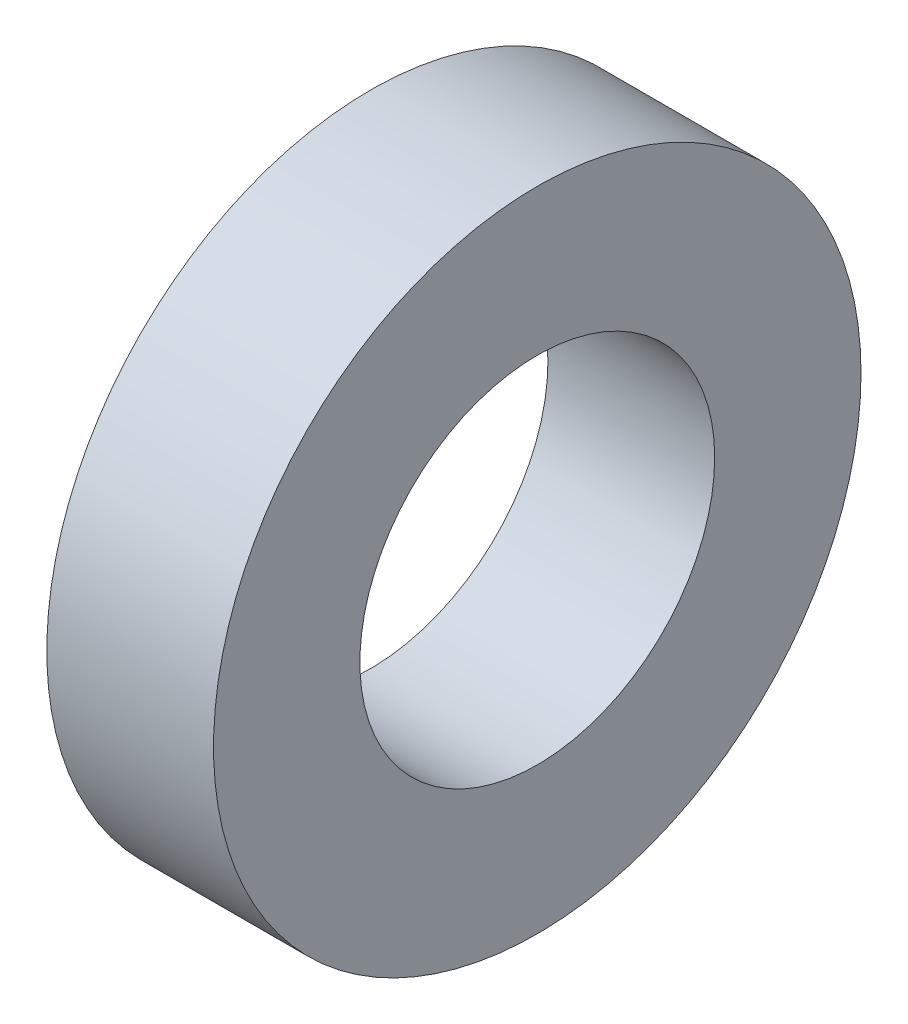
ISO-10303-21;
HEADER;
FILE_DESCRIPTION(('STEP AP214'),'2;1');
FILE_NAME('part.step','',(''),(''),'','','');
FILE_SCHEMA(('AUTOMOTIVE_DESIGN { 1 0 10303 214 1 1 1 1 }'));
ENDSEC;
DATA;
#1=APPLICATION_CONTEXT('core data for automotive mechanical design processes');
#2=APPLICATION_PROTOCOL_DEFINITION('international standard','automotive_design',2000,#1);
#3=PRODUCT_CONTEXT('',#1,'mechanical');
#4=PRODUCT('Part','Part','',(#3));
#5=PRODUCT_RELATED_PRODUCT_CATEGORY('part','',(#4));
#6=PRODUCT_DEFINITION_FORMATION('','',#4);
#7=PRODUCT_DEFINITION_CONTEXT('part definition',#1,'design');
#8=PRODUCT_DEFINITION('design','',#6,#7);
#9=PRODUCT_DEFINITION_SHAPE('','',#8);
#10=(LENGTH_UNIT() NAMED_UNIT(*) SI_UNIT(.MILLI.,.METRE.));
#11=(NAMED_UNIT(*) PLANE_ANGLE_UNIT() SI_UNIT($,.RADIAN.));
#12=(NAMED_UNIT(*) SI_UNIT($,.STERADIAN.) SOLID_ANGLE_UNIT());
#13=UNCERTAINTY_MEASURE_WITH_UNIT(LENGTH_MEASURE(1.E-05),#10,'distance_accuracy_value','');
#14=(GEOMETRIC_REPRESENTATION_CONTEXT(3) GLOBAL_UNCERTAINTY_ASSIGNED_CONTEXT((#13)) GLOBAL_UNIT_ASSIGNED_CONTEXT((#10,
#11,#12)) REPRESENTATION_CONTEXT('',''));
#15=CARTESIAN_POINT('',(0.,0.,0.));
#16=DIRECTION('',(0.,0.,1.));
#17=DIRECTION('',(1.,0.,0.));
#18=AXIS2_PLACEMENT_3D('',#15,#16,#17);
#19=CARTESIAN_POINT('',(18.6,-1.4125,0.));
#20=DIRECTION('',(-1.,0.,0.));
#21=DIRECTION('',(0.,0.,1.));
#22=AXIS2_PLACEMENT_3D('',#19,#20,#21);
#23=PLANE('',#22);
#24=CARTESIAN_POINT('',(18.6,0.,0.));
#25=DIRECTION('',(1.,0.,0.));
#26=DIRECTION('',(0.,0.,-1.));
#27=AXIS2_PLACEMENT_3D('',#24,#25,#26);
#28=CIRCLE('',#27,1.825);
#29=CARTESIAN_POINT('',(18.6,0.,-1.825));
#30=VERTEX_POINT('',#29);
#31=EDGE_CURVE('E17',#30,#30,#28,.T.);
#32=ORIENTED_EDGE('',*,*,#31,.F.);
#33=EDGE_LOOP('',(#32));
#34=FACE_BOUND('',#33,.T.);
#35=CARTESIAN_POINT('',(18.6,0.,0.));
#36=DIRECTION('',(1.,0.,0.));
#37=DIRECTION('',(0.,0.,-1.));
#38=AXIS2_PLACEMENT_3D('',#35,#36,#37);
#39=CIRCLE('',#38,1.);
#40=CARTESIAN_POINT('',(18.6,0.,-1.));
#41=VERTEX_POINT('',#40);
#42=EDGE_CURVE('E26',#41,#41,#39,.T.);
#43=ORIENTED_EDGE('',*,*,#42,.T.);
#44=EDGE_LOOP('',(#43));
#45=FACE_BOUND('',#44,.T.);
#46=ADVANCED_FACE('F14',(#34,#45),#23,.T.);
#47=CARTESIAN_POINT('',(19.07,0.,0.));
#48=DIRECTION('',(1.,0.,0.));
#49=DIRECTION('',(0.,0.,-1.));
#50=AXIS2_PLACEMENT_3D('',#47,#48,#49);
#51=CYLINDRICAL_SURFACE('',#50,1.825);
#52=ORIENTED_EDGE('',*,*,#31,.T.);
#53=EDGE_LOOP('',(#52));
#54=FACE_BOUND('',#53,.T.);
#55=CARTESIAN_POINT('',(19.54,0.,0.));
#56=DIRECTION('',(1.,0.,0.));
#57=DIRECTION('',(0.,0.,-1.));
#58=AXIS2_PLACEMENT_3D('',#55,#56,#57);
#59=CIRCLE('',#58,1.825);
#60=CARTESIAN_POINT('',(19.54,0.,-1.825));
#61=VERTEX_POINT('',#60);
#62=EDGE_CURVE('E21',#61,#61,#59,.T.);
#63=ORIENTED_EDGE('',*,*,#62,.F.);
#64=EDGE_LOOP('',(#63));
#65=FACE_BOUND('',#64,.T.);
#66=ADVANCED_FACE('F34',(#54,#65),#51,.T.);
#67=CARTESIAN_POINT('',(19.07,0.,0.));
#68=DIRECTION('',(1.,0.,0.));
#69=DIRECTION('',(0.,0.,-1.));
#70=AXIS2_PLACEMENT_3D('',#67,#68,#69);
#71=CYLINDRICAL_SURFACE('',#70,1.);
#72=CARTESIAN_POINT('',(19.54,0.,0.));
#73=DIRECTION('',(1.,0.,0.));
#74=DIRECTION('',(0.,0.,-1.));
#75=AXIS2_PLACEMENT_3D('',#72,#73,#74);
#76=CIRCLE('',#75,1.);
#77=CARTESIAN_POINT('',(19.54,0.,-1.));
#78=VERTEX_POINT('',#77);
#79=EDGE_CURVE('E10',#78,#78,#76,.F.);
#80=ORIENTED_EDGE('',*,*,#79,.F.);
#81=EDGE_LOOP('',(#80));
#82=FACE_BOUND('',#81,.T.);
#83=ORIENTED_EDGE('',*,*,#42,.F.);
#84=EDGE_LOOP('',(#83));
#85=FACE_BOUND('',#84,.T.);
#86=ADVANCED_FACE('F42',(#82,#85),#71,.F.);
#87=CARTESIAN_POINT('',(19.54,-1.4125,0.));
#88=DIRECTION('',(1.,0.,0.));
#89=DIRECTION('',(0.,0.,-1.));
#90=AXIS2_PLACEMENT_3D('',#87,#88,#89);
#91=PLANE('',#90);
#92=ORIENTED_EDGE('',*,*,#79,.T.);
#93=EDGE_LOOP('',(#92));
#94=FACE_BOUND('',#93,.T.);
#95=ORIENTED_EDGE('',*,*,#62,.T.);
#96=EDGE_LOOP('',(#95));
#97=FACE_BOUND('',#96,.T.);
#98=ADVANCED_FACE('F43',(#94,#97),#91,.T.);
#99=CLOSED_SHELL('',(#46,#66,#86,#98));
#100=MANIFOLD_SOLID_BREP('B1',#99);
#101=ADVANCED_BREP_SHAPE_REPRESENTATION('',(#18,#100),#14);
#102=SHAPE_DEFINITION_REPRESENTATION(#9,#101);
ENDSEC;
END-ISO-10303-21;
